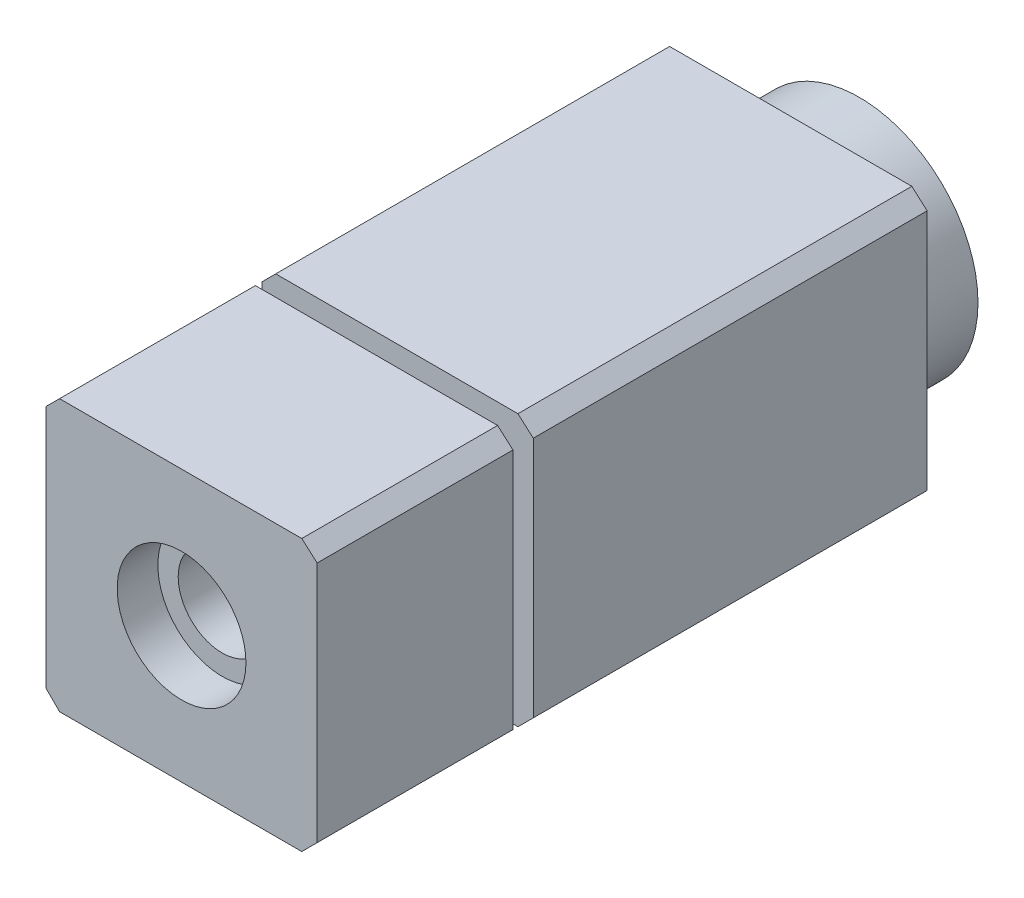
ISO-10303-21;
HEADER;
FILE_DESCRIPTION(('STEP AP214'),'2;1');
FILE_NAME('part.step','',(''),(''),'','','');
FILE_SCHEMA(('AUTOMOTIVE_DESIGN { 1 0 10303 214 1 1 1 1 }'));
ENDSEC;
DATA;
#1=APPLICATION_CONTEXT('core data for automotive mechanical design processes');
#2=APPLICATION_PROTOCOL_DEFINITION('international standard','automotive_design',2000,#1);
#3=PRODUCT_CONTEXT('',#1,'mechanical');
#4=PRODUCT('Part','Part','',(#3));
#5=PRODUCT_RELATED_PRODUCT_CATEGORY('part','',(#4));
#6=PRODUCT_DEFINITION_FORMATION('','',#4);
#7=PRODUCT_DEFINITION_CONTEXT('part definition',#1,'design');
#8=PRODUCT_DEFINITION('design','',#6,#7);
#9=PRODUCT_DEFINITION_SHAPE('','',#8);
#10=(LENGTH_UNIT() NAMED_UNIT(*) SI_UNIT(.MILLI.,.METRE.));
#11=(NAMED_UNIT(*) PLANE_ANGLE_UNIT() SI_UNIT($,.RADIAN.));
#12=(NAMED_UNIT(*) SI_UNIT($,.STERADIAN.) SOLID_ANGLE_UNIT());
#13=UNCERTAINTY_MEASURE_WITH_UNIT(LENGTH_MEASURE(1.E-05),#10,'distance_accuracy_value','');
#14=(GEOMETRIC_REPRESENTATION_CONTEXT(3) GLOBAL_UNCERTAINTY_ASSIGNED_CONTEXT((#13)) GLOBAL_UNIT_ASSIGNED_CONTEXT((#10,
#11,#12)) REPRESENTATION_CONTEXT('',''));
#15=CARTESIAN_POINT('',(0.,0.,0.));
#16=DIRECTION('',(0.,0.,1.));
#17=DIRECTION('',(1.,0.,0.));
#18=AXIS2_PLACEMENT_3D('',#15,#16,#17);
#19=CARTESIAN_POINT('',(-20.,18.,80.));
#20=DIRECTION('',(1.,0.,0.));
#21=DIRECTION('',(0.,0.,-1.));
#22=AXIS2_PLACEMENT_3D('',#19,#20,#21);
#23=PLANE('',#22);
#24=DIRECTION('',(0.,1.,0.));
#25=VECTOR('',#24,1.);
#26=CARTESIAN_POINT('',(-20.,-18.,61.11));
#27=LINE('',#26,#25);
#28=CARTESIAN_POINT('',(-20.,-18.,61.11));
#29=VERTEX_POINT('',#28);
#30=CARTESIAN_POINT('',(-20.,18.,61.11));
#31=VERTEX_POINT('',#30);
#32=EDGE_CURVE('E93',#29,#31,#27,.T.);
#33=ORIENTED_EDGE('',*,*,#32,.F.);
#34=DIRECTION('',(0.,0.,-1.));
#35=VECTOR('',#34,1.);
#36=CARTESIAN_POINT('',(-20.,-18.,80.));
#37=LINE('',#36,#35);
#38=CARTESIAN_POINT('',(-20.,-18.,90.));
#39=VERTEX_POINT('',#38);
#40=EDGE_CURVE('E77',#39,#29,#37,.T.);
#41=ORIENTED_EDGE('',*,*,#40,.F.);
#42=DIRECTION('',(0.,-1.,0.));
#43=VECTOR('',#42,1.);
#44=CARTESIAN_POINT('',(-20.,18.,90.));
#45=LINE('',#44,#43);
#46=CARTESIAN_POINT('',(-20.,18.,90.));
#47=VERTEX_POINT('',#46);
#48=EDGE_CURVE('E196',#47,#39,#45,.T.);
#49=ORIENTED_EDGE('',*,*,#48,.F.);
#50=DIRECTION('',(0.,0.,-1.));
#51=VECTOR('',#50,1.);
#52=CARTESIAN_POINT('',(-20.,18.,80.));
#53=LINE('',#52,#51);
#54=EDGE_CURVE('E183',#47,#31,#53,.T.);
#55=ORIENTED_EDGE('',*,*,#54,.T.);
#56=EDGE_LOOP('',(#33,#41,#49,#55));
#57=FACE_BOUND('',#56,.T.);
#58=ADVANCED_FACE('F67',(#57),#23,.F.);
#59=CARTESIAN_POINT('',(-18.,-20.,80.));
#60=DIRECTION('',(0.707106781186544,0.707106781186551,0.));
#61=DIRECTION('',(-0.707106781186551,0.707106781186544,0.));
#62=AXIS2_PLACEMENT_3D('',#59,#60,#61);
#63=PLANE('',#62);
#64=DIRECTION('',(-0.707106781186551,0.707106781186544,0.));
#65=VECTOR('',#64,1.);
#66=CARTESIAN_POINT('',(-18.,-20.,61.11));
#67=LINE('',#66,#65);
#68=CARTESIAN_POINT('',(-18.,-20.,61.11));
#69=VERTEX_POINT('',#68);
#70=EDGE_CURVE('E237',#69,#29,#67,.T.);
#71=ORIENTED_EDGE('',*,*,#70,.F.);
#72=DIRECTION('',(0.,0.,-1.));
#73=VECTOR('',#72,1.);
#74=CARTESIAN_POINT('',(-18.,-20.,80.));
#75=LINE('',#74,#73);
#76=CARTESIAN_POINT('',(-18.,-20.,90.));
#77=VERTEX_POINT('',#76);
#78=EDGE_CURVE('E371',#77,#69,#75,.T.);
#79=ORIENTED_EDGE('',*,*,#78,.F.);
#80=DIRECTION('',(0.707106781186551,-0.707106781186544,0.));
#81=VECTOR('',#80,1.);
#82=CARTESIAN_POINT('',(-20.,-18.,90.));
#83=LINE('',#82,#81);
#84=EDGE_CURVE('E202',#39,#77,#83,.T.);
#85=ORIENTED_EDGE('',*,*,#84,.F.);
#86=ORIENTED_EDGE('',*,*,#40,.T.);
#87=EDGE_LOOP('',(#71,#79,#85,#86));
#88=FACE_BOUND('',#87,.T.);
#89=ADVANCED_FACE('F507',(#88),#63,.F.);
#90=CARTESIAN_POINT('',(-18.,-20.,80.));
#91=DIRECTION('',(0.,1.,0.));
#92=DIRECTION('',(0.,0.,1.));
#93=AXIS2_PLACEMENT_3D('',#90,#91,#92);
#94=PLANE('',#93);
#95=DIRECTION('',(-1.,0.,0.));
#96=VECTOR('',#95,1.);
#97=CARTESIAN_POINT('',(17.7358097334592,-20.,61.11));
#98=LINE('',#97,#96);
#99=CARTESIAN_POINT('',(17.7358097334592,-20.,61.11));
#100=VERTEX_POINT('',#99);
#101=EDGE_CURVE('E246',#100,#69,#98,.T.);
#102=ORIENTED_EDGE('',*,*,#101,.F.);
#103=DIRECTION('',(0.,0.,-1.));
#104=VECTOR('',#103,1.);
#105=CARTESIAN_POINT('',(17.7358097334592,-20.,80.));
#106=LINE('',#105,#104);
#107=CARTESIAN_POINT('',(17.7358097334592,-20.,90.));
#108=VERTEX_POINT('',#107);
#109=EDGE_CURVE('E366',#108,#100,#106,.T.);
#110=ORIENTED_EDGE('',*,*,#109,.F.);
#111=DIRECTION('',(1.,0.,0.));
#112=VECTOR('',#111,1.);
#113=CARTESIAN_POINT('',(-18.,-20.,90.));
#114=LINE('',#113,#112);
#115=EDGE_CURVE('E215',#77,#108,#114,.T.);
#116=ORIENTED_EDGE('',*,*,#115,.F.);
#117=ORIENTED_EDGE('',*,*,#78,.T.);
#118=EDGE_LOOP('',(#102,#110,#116,#117));
#119=FACE_BOUND('',#118,.T.);
#120=ADVANCED_FACE('F511',(#119),#94,.F.);
#121=CARTESIAN_POINT('',(17.7358097334592,-20.,80.));
#122=DIRECTION('',(-0.707106781186549,0.707106781186546,0.));
#123=DIRECTION('',(-0.707106781186546,-0.707106781186549,0.));
#124=AXIS2_PLACEMENT_3D('',#121,#122,#123);
#125=PLANE('',#124);
#126=DIRECTION('',(-0.707106781186546,-0.707106781186548,0.));
#127=VECTOR('',#126,1.);
#128=CARTESIAN_POINT('',(20.,-17.7358097334592,61.11));
#129=LINE('',#128,#127);
#130=CARTESIAN_POINT('',(20.,-17.7358097334592,61.11));
#131=VERTEX_POINT('',#130);
#132=EDGE_CURVE('E286',#131,#100,#129,.T.);
#133=ORIENTED_EDGE('',*,*,#132,.F.);
#134=DIRECTION('',(0.,0.,-1.));
#135=VECTOR('',#134,1.);
#136=CARTESIAN_POINT('',(20.,-17.7358097334592,80.));
#137=LINE('',#136,#135);
#138=CARTESIAN_POINT('',(20.,-17.7358097334592,90.));
#139=VERTEX_POINT('',#138);
#140=EDGE_CURVE('E361',#139,#131,#137,.T.);
#141=ORIENTED_EDGE('',*,*,#140,.F.);
#142=DIRECTION('',(0.707106781186546,0.707106781186548,0.));
#143=VECTOR('',#142,1.);
#144=CARTESIAN_POINT('',(17.7358097334592,-20.,90.));
#145=LINE('',#144,#143);
#146=EDGE_CURVE('E219',#108,#139,#145,.T.);
#147=ORIENTED_EDGE('',*,*,#146,.F.);
#148=ORIENTED_EDGE('',*,*,#109,.T.);
#149=EDGE_LOOP('',(#133,#141,#147,#148));
#150=FACE_BOUND('',#149,.T.);
#151=ADVANCED_FACE('F539',(#150),#125,.F.);
#152=CARTESIAN_POINT('',(20.,18.,80.));
#153=DIRECTION('',(-1.,0.,0.));
#154=DIRECTION('',(0.,0.,1.));
#155=AXIS2_PLACEMENT_3D('',#152,#153,#154);
#156=PLANE('',#155);
#157=DIRECTION('',(0.,-1.,0.));
#158=VECTOR('',#157,1.);
#159=CARTESIAN_POINT('',(20.,18.,61.11));
#160=LINE('',#159,#158);
#161=CARTESIAN_POINT('',(20.,18.,61.11));
#162=VERTEX_POINT('',#161);
#163=EDGE_CURVE('E283',#162,#131,#160,.T.);
#164=ORIENTED_EDGE('',*,*,#163,.F.);
#165=DIRECTION('',(0.,0.,-1.));
#166=VECTOR('',#165,1.);
#167=CARTESIAN_POINT('',(20.,18.,80.));
#168=LINE('',#167,#166);
#169=CARTESIAN_POINT('',(20.,18.,90.));
#170=VERTEX_POINT('',#169);
#171=EDGE_CURVE('E356',#170,#162,#168,.T.);
#172=ORIENTED_EDGE('',*,*,#171,.F.);
#173=DIRECTION('',(0.,1.,0.));
#174=VECTOR('',#173,1.);
#175=CARTESIAN_POINT('',(20.,-17.7358097334592,90.));
#176=LINE('',#175,#174);
#177=EDGE_CURVE('E223',#139,#170,#176,.T.);
#178=ORIENTED_EDGE('',*,*,#177,.F.);
#179=ORIENTED_EDGE('',*,*,#140,.T.);
#180=EDGE_LOOP('',(#164,#172,#178,#179));
#181=FACE_BOUND('',#180,.T.);
#182=ADVANCED_FACE('F536',(#181),#156,.F.);
#183=CARTESIAN_POINT('',(17.7358097334592,20.,80.));
#184=DIRECTION('',(-0.662028211883854,-0.749478916761417,0.));
#185=DIRECTION('',(0.749478916761417,-0.662028211883854,0.));
#186=AXIS2_PLACEMENT_3D('',#183,#184,#185);
#187=PLANE('',#186);
#188=DIRECTION('',(0.749478916761417,-0.662028211883854,0.));
#189=VECTOR('',#188,1.);
#190=CARTESIAN_POINT('',(17.7358097334592,20.,61.11));
#191=LINE('',#190,#189);
#192=CARTESIAN_POINT('',(17.7358097334592,20.,61.11));
#193=VERTEX_POINT('',#192);
#194=EDGE_CURVE('E280',#193,#162,#191,.T.);
#195=ORIENTED_EDGE('',*,*,#194,.F.);
#196=DIRECTION('',(0.,0.,-1.));
#197=VECTOR('',#196,1.);
#198=CARTESIAN_POINT('',(17.7358097334592,20.,80.));
#199=LINE('',#198,#197);
#200=CARTESIAN_POINT('',(17.7358097334592,20.,90.));
#201=VERTEX_POINT('',#200);
#202=EDGE_CURVE('E351',#201,#193,#199,.T.);
#203=ORIENTED_EDGE('',*,*,#202,.F.);
#204=DIRECTION('',(-0.749478916761417,0.662028211883854,0.));
#205=VECTOR('',#204,1.);
#206=CARTESIAN_POINT('',(20.,18.,90.));
#207=LINE('',#206,#205);
#208=EDGE_CURVE('E227',#170,#201,#207,.T.);
#209=ORIENTED_EDGE('',*,*,#208,.F.);
#210=ORIENTED_EDGE('',*,*,#171,.T.);
#211=EDGE_LOOP('',(#195,#203,#209,#210));
#212=FACE_BOUND('',#211,.T.);
#213=ADVANCED_FACE('F522',(#212),#187,.F.);
#214=CARTESIAN_POINT('',(-18.,20.,80.));
#215=DIRECTION('',(0.,-1.,0.));
#216=DIRECTION('',(0.,0.,-1.));
#217=AXIS2_PLACEMENT_3D('',#214,#215,#216);
#218=PLANE('',#217);
#219=DIRECTION('',(1.,0.,0.));
#220=VECTOR('',#219,1.);
#221=CARTESIAN_POINT('',(-18.,20.,61.11));
#222=LINE('',#221,#220);
#223=CARTESIAN_POINT('',(-18.,20.,61.11));
#224=VERTEX_POINT('',#223);
#225=EDGE_CURVE('E277',#224,#193,#222,.T.);
#226=ORIENTED_EDGE('',*,*,#225,.F.);
#227=DIRECTION('',(0.,0.,-1.));
#228=VECTOR('',#227,1.);
#229=CARTESIAN_POINT('',(-18.,20.,80.));
#230=LINE('',#229,#228);
#231=CARTESIAN_POINT('',(-18.,20.,90.));
#232=VERTEX_POINT('',#231);
#233=EDGE_CURVE('E347',#232,#224,#230,.T.);
#234=ORIENTED_EDGE('',*,*,#233,.F.);
#235=DIRECTION('',(-1.,0.,0.));
#236=VECTOR('',#235,1.);
#237=CARTESIAN_POINT('',(17.7358097334592,20.,90.));
#238=LINE('',#237,#236);
#239=EDGE_CURVE('E208',#201,#232,#238,.T.);
#240=ORIENTED_EDGE('',*,*,#239,.F.);
#241=ORIENTED_EDGE('',*,*,#202,.T.);
#242=EDGE_LOOP('',(#226,#234,#240,#241));
#243=FACE_BOUND('',#242,.T.);
#244=ADVANCED_FACE('F517',(#243),#218,.F.);
#245=CARTESIAN_POINT('',(-20.,18.,80.));
#246=DIRECTION('',(0.707106781186548,-0.707106781186548,0.));
#247=DIRECTION('',(0.707106781186548,0.707106781186548,0.));
#248=AXIS2_PLACEMENT_3D('',#245,#246,#247);
#249=PLANE('',#248);
#250=DIRECTION('',(0.707106781186548,0.707106781186548,0.));
#251=VECTOR('',#250,1.);
#252=CARTESIAN_POINT('',(-20.,18.,61.11));
#253=LINE('',#252,#251);
#254=EDGE_CURVE('E189',#31,#224,#253,.T.);
#255=ORIENTED_EDGE('',*,*,#254,.F.);
#256=ORIENTED_EDGE('',*,*,#54,.F.);
#257=DIRECTION('',(-0.707106781186548,-0.707106781186548,0.));
#258=VECTOR('',#257,1.);
#259=CARTESIAN_POINT('',(-18.,20.,90.));
#260=LINE('',#259,#258);
#261=EDGE_CURVE('E188',#232,#47,#260,.T.);
#262=ORIENTED_EDGE('',*,*,#261,.F.);
#263=ORIENTED_EDGE('',*,*,#233,.T.);
#264=EDGE_LOOP('',(#255,#256,#262,#263));
#265=FACE_BOUND('',#264,.T.);
#266=ADVANCED_FACE('F185',(#265),#249,.F.);
#267=CARTESIAN_POINT('',(-20.,-18.,58.11));
#268=VERTEX_POINT('',#267);
#269=CARTESIAN_POINT('',(-20.,-18.,0.));
#270=VERTEX_POINT('',#269);
#271=EDGE_CURVE('E374',#268,#270,#37,.T.);
#272=ORIENTED_EDGE('',*,*,#271,.F.);
#273=DIRECTION('',(0.,1.,0.));
#274=VECTOR('',#273,1.);
#275=CARTESIAN_POINT('',(-20.,-18.,58.11));
#276=LINE('',#275,#274);
#277=CARTESIAN_POINT('',(-20.,18.,58.11));
#278=VERTEX_POINT('',#277);
#279=EDGE_CURVE('E245',#268,#278,#276,.T.);
#280=ORIENTED_EDGE('',*,*,#279,.T.);
#281=CARTESIAN_POINT('',(-20.,18.,0.));
#282=VERTEX_POINT('',#281);
#283=EDGE_CURVE('E193',#278,#282,#53,.T.);
#284=ORIENTED_EDGE('',*,*,#283,.T.);
#285=DIRECTION('',(0.,-1.,0.));
#286=VECTOR('',#285,1.);
#287=CARTESIAN_POINT('',(-20.,18.,0.));
#288=LINE('',#287,#286);
#289=EDGE_CURVE('E314',#282,#270,#288,.T.);
#290=ORIENTED_EDGE('',*,*,#289,.T.);
#291=EDGE_LOOP('',(#272,#280,#284,#290));
#292=FACE_BOUND('',#291,.T.);
#293=ADVANCED_FACE('F69',(#292),#23,.F.);
#294=CARTESIAN_POINT('',(-18.,-20.,58.11));
#295=VERTEX_POINT('',#294);
#296=CARTESIAN_POINT('',(-18.,-20.,0.));
#297=VERTEX_POINT('',#296);
#298=EDGE_CURVE('E370',#295,#297,#75,.T.);
#299=ORIENTED_EDGE('',*,*,#298,.F.);
#300=DIRECTION('',(-0.707106781186551,0.707106781186544,0.));
#301=VECTOR('',#300,1.);
#302=CARTESIAN_POINT('',(-18.,-20.,58.11));
#303=LINE('',#302,#301);
#304=EDGE_CURVE('E241',#295,#268,#303,.T.);
#305=ORIENTED_EDGE('',*,*,#304,.T.);
#306=ORIENTED_EDGE('',*,*,#271,.T.);
#307=DIRECTION('',(0.707106781186551,-0.707106781186544,0.));
#308=VECTOR('',#307,1.);
#309=CARTESIAN_POINT('',(-18.,-20.,0.));
#310=LINE('',#309,#308);
#311=EDGE_CURVE('E319',#270,#297,#310,.T.);
#312=ORIENTED_EDGE('',*,*,#311,.T.);
#313=EDGE_LOOP('',(#299,#305,#306,#312));
#314=FACE_BOUND('',#313,.T.);
#315=ADVANCED_FACE('F385',(#314),#63,.F.);
#316=CARTESIAN_POINT('',(17.7358097334592,-20.,58.11));
#317=VERTEX_POINT('',#316);
#318=CARTESIAN_POINT('',(17.7358097334592,-20.,0.));
#319=VERTEX_POINT('',#318);
#320=EDGE_CURVE('E365',#317,#319,#106,.T.);
#321=ORIENTED_EDGE('',*,*,#320,.F.);
#322=DIRECTION('',(-1.,0.,0.));
#323=VECTOR('',#322,1.);
#324=CARTESIAN_POINT('',(17.7358097334592,-20.,58.11));
#325=LINE('',#324,#323);
#326=EDGE_CURVE('E267',#317,#295,#325,.T.);
#327=ORIENTED_EDGE('',*,*,#326,.T.);
#328=ORIENTED_EDGE('',*,*,#298,.T.);
#329=DIRECTION('',(1.,0.,0.));
#330=VECTOR('',#329,1.);
#331=CARTESIAN_POINT('',(-18.,-20.,0.));
#332=LINE('',#331,#330);
#333=EDGE_CURVE('E323',#297,#319,#332,.T.);
#334=ORIENTED_EDGE('',*,*,#333,.T.);
#335=EDGE_LOOP('',(#321,#327,#328,#334));
#336=FACE_BOUND('',#335,.T.);
#337=ADVANCED_FACE('F417',(#336),#94,.F.);
#338=CARTESIAN_POINT('',(20.,-17.7358097334592,58.11));
#339=VERTEX_POINT('',#338);
#340=CARTESIAN_POINT('',(20.,-17.7358097334592,0.));
#341=VERTEX_POINT('',#340);
#342=EDGE_CURVE('E360',#339,#341,#137,.T.);
#343=ORIENTED_EDGE('',*,*,#342,.F.);
#344=DIRECTION('',(-0.707106781186546,-0.707106781186548,0.));
#345=VECTOR('',#344,1.);
#346=CARTESIAN_POINT('',(20.,-17.7358097334592,58.11));
#347=LINE('',#346,#345);
#348=EDGE_CURVE('E263',#339,#317,#347,.T.);
#349=ORIENTED_EDGE('',*,*,#348,.T.);
#350=ORIENTED_EDGE('',*,*,#320,.T.);
#351=DIRECTION('',(0.707106781186546,0.707106781186548,0.));
#352=VECTOR('',#351,1.);
#353=CARTESIAN_POINT('',(17.7358097334592,-20.,0.));
#354=LINE('',#353,#352);
#355=EDGE_CURVE('E327',#319,#341,#354,.T.);
#356=ORIENTED_EDGE('',*,*,#355,.T.);
#357=EDGE_LOOP('',(#343,#349,#350,#356));
#358=FACE_BOUND('',#357,.T.);
#359=ADVANCED_FACE('F413',(#358),#125,.F.);
#360=CARTESIAN_POINT('',(20.,18.,58.11));
#361=VERTEX_POINT('',#360);
#362=CARTESIAN_POINT('',(20.,18.,0.));
#363=VERTEX_POINT('',#362);
#364=EDGE_CURVE('E355',#361,#363,#168,.T.);
#365=ORIENTED_EDGE('',*,*,#364,.F.);
#366=DIRECTION('',(0.,-1.,0.));
#367=VECTOR('',#366,1.);
#368=CARTESIAN_POINT('',(20.,18.,58.11));
#369=LINE('',#368,#367);
#370=EDGE_CURVE('E259',#361,#339,#369,.T.);
#371=ORIENTED_EDGE('',*,*,#370,.T.);
#372=ORIENTED_EDGE('',*,*,#342,.T.);
#373=DIRECTION('',(0.,1.,0.));
#374=VECTOR('',#373,1.);
#375=CARTESIAN_POINT('',(20.,18.,0.));
#376=LINE('',#375,#374);
#377=EDGE_CURVE('E331',#341,#363,#376,.T.);
#378=ORIENTED_EDGE('',*,*,#377,.T.);
#379=EDGE_LOOP('',(#365,#371,#372,#378));
#380=FACE_BOUND('',#379,.T.);
#381=ADVANCED_FACE('F410',(#380),#156,.F.);
#382=CARTESIAN_POINT('',(17.7358097334592,20.,58.11));
#383=VERTEX_POINT('',#382);
#384=CARTESIAN_POINT('',(17.7358097334592,20.,0.));
#385=VERTEX_POINT('',#384);
#386=EDGE_CURVE('E350',#383,#385,#199,.T.);
#387=ORIENTED_EDGE('',*,*,#386,.F.);
#388=DIRECTION('',(0.749478916761417,-0.662028211883854,0.));
#389=VECTOR('',#388,1.);
#390=CARTESIAN_POINT('',(17.7358097334592,20.,58.11));
#391=LINE('',#390,#389);
#392=EDGE_CURVE('E255',#383,#361,#391,.T.);
#393=ORIENTED_EDGE('',*,*,#392,.T.);
#394=ORIENTED_EDGE('',*,*,#364,.T.);
#395=DIRECTION('',(-0.749478916761417,0.662028211883854,0.));
#396=VECTOR('',#395,1.);
#397=CARTESIAN_POINT('',(17.7358097334592,20.,0.));
#398=LINE('',#397,#396);
#399=EDGE_CURVE('E335',#363,#385,#398,.T.);
#400=ORIENTED_EDGE('',*,*,#399,.T.);
#401=EDGE_LOOP('',(#387,#393,#394,#400));
#402=FACE_BOUND('',#401,.T.);
#403=ADVANCED_FACE('F406',(#402),#187,.F.);
#404=CARTESIAN_POINT('',(-18.,20.,58.11));
#405=VERTEX_POINT('',#404);
#406=CARTESIAN_POINT('',(-18.,20.,0.));
#407=VERTEX_POINT('',#406);
#408=EDGE_CURVE('E192',#405,#407,#230,.T.);
#409=ORIENTED_EDGE('',*,*,#408,.F.);
#410=DIRECTION('',(1.,0.,0.));
#411=VECTOR('',#410,1.);
#412=CARTESIAN_POINT('',(-18.,20.,58.11));
#413=LINE('',#412,#411);
#414=EDGE_CURVE('E85',#405,#383,#413,.T.);
#415=ORIENTED_EDGE('',*,*,#414,.T.);
#416=ORIENTED_EDGE('',*,*,#386,.T.);
#417=DIRECTION('',(-1.,0.,0.));
#418=VECTOR('',#417,1.);
#419=CARTESIAN_POINT('',(-18.,20.,0.));
#420=LINE('',#419,#418);
#421=EDGE_CURVE('E339',#385,#407,#420,.T.);
#422=ORIENTED_EDGE('',*,*,#421,.T.);
#423=EDGE_LOOP('',(#409,#415,#416,#422));
#424=FACE_BOUND('',#423,.T.);
#425=ADVANCED_FACE('F402',(#424),#218,.F.);
#426=ORIENTED_EDGE('',*,*,#283,.F.);
#427=DIRECTION('',(0.707106781186548,0.707106781186548,0.));
#428=VECTOR('',#427,1.);
#429=CARTESIAN_POINT('',(-20.,18.,58.11));
#430=LINE('',#429,#428);
#431=EDGE_CURVE('E250',#278,#405,#430,.T.);
#432=ORIENTED_EDGE('',*,*,#431,.T.);
#433=ORIENTED_EDGE('',*,*,#408,.T.);
#434=DIRECTION('',(-0.707106781186548,-0.707106781186548,0.));
#435=VECTOR('',#434,1.);
#436=CARTESIAN_POINT('',(-20.,18.,0.));
#437=LINE('',#436,#435);
#438=EDGE_CURVE('E343',#407,#282,#437,.T.);
#439=ORIENTED_EDGE('',*,*,#438,.T.);
#440=EDGE_LOOP('',(#426,#432,#433,#439));
#441=FACE_BOUND('',#440,.T.);
#442=ADVANCED_FACE('F396',(#441),#249,.F.);
#443=CARTESIAN_POINT('',(0.,0.,0.));
#444=DIRECTION('',(0.,0.,1.));
#445=DIRECTION('',(1.,0.,0.));
#446=AXIS2_PLACEMENT_3D('',#443,#444,#445);
#447=PLANE('',#446);
#448=CARTESIAN_POINT('',(0.,0.,0.));
#449=DIRECTION('',(0.,0.,-1.));
#450=DIRECTION('',(-1.,0.,0.));
#451=AXIS2_PLACEMENT_3D('',#448,#449,#450);
#452=CIRCLE('',#451,17.5);
#453=CARTESIAN_POINT('',(-17.5,0.,0.));
#454=VERTEX_POINT('',#453);
#455=EDGE_CURVE('E12',#454,#454,#452,.T.);
#456=ORIENTED_EDGE('',*,*,#455,.F.);
#457=EDGE_LOOP('',(#456));
#458=FACE_BOUND('',#457,.T.);
#459=ORIENTED_EDGE('',*,*,#289,.F.);
#460=ORIENTED_EDGE('',*,*,#438,.F.);
#461=ORIENTED_EDGE('',*,*,#421,.F.);
#462=ORIENTED_EDGE('',*,*,#399,.F.);
#463=ORIENTED_EDGE('',*,*,#377,.F.);
#464=ORIENTED_EDGE('',*,*,#355,.F.);
#465=ORIENTED_EDGE('',*,*,#333,.F.);
#466=ORIENTED_EDGE('',*,*,#311,.F.);
#467=EDGE_LOOP('',(#459,#460,#461,#462,#463,#464,#465,#466));
#468=FACE_BOUND('',#467,.T.);
#469=ADVANCED_FACE('F390',(#458,#468),#447,.F.);
#470=CARTESIAN_POINT('',(0.,0.,90.));
#471=DIRECTION('',(0.,0.,1.));
#472=DIRECTION('',(1.,0.,0.));
#473=AXIS2_PLACEMENT_3D('',#470,#471,#472);
#474=PLANE('',#473);
#475=CARTESIAN_POINT('',(0.,0.,90.));
#476=DIRECTION('',(0.,0.,1.));
#477=DIRECTION('',(1.,0.,0.));
#478=AXIS2_PLACEMENT_3D('',#475,#476,#477);
#479=CIRCLE('',#478,9.5);
#480=CARTESIAN_POINT('',(9.5,0.,90.));
#481=VERTEX_POINT('',#480);
#482=EDGE_CURVE('E295',#481,#481,#479,.T.);
#483=ORIENTED_EDGE('',*,*,#482,.F.);
#484=EDGE_LOOP('',(#483));
#485=FACE_BOUND('',#484,.T.);
#486=ORIENTED_EDGE('',*,*,#261,.T.);
#487=ORIENTED_EDGE('',*,*,#48,.T.);
#488=ORIENTED_EDGE('',*,*,#84,.T.);
#489=ORIENTED_EDGE('',*,*,#115,.T.);
#490=ORIENTED_EDGE('',*,*,#146,.T.);
#491=ORIENTED_EDGE('',*,*,#177,.T.);
#492=ORIENTED_EDGE('',*,*,#208,.T.);
#493=ORIENTED_EDGE('',*,*,#239,.T.);
#494=EDGE_LOOP('',(#486,#487,#488,#489,#490,#491,#492,#493));
#495=FACE_BOUND('',#494,.T.);
#496=ADVANCED_FACE('F205',(#485,#495),#474,.T.);
#497=CARTESIAN_POINT('',(0.,0.,-10.));
#498=DIRECTION('',(0.,0.,1.));
#499=DIRECTION('',(1.,0.,0.));
#500=AXIS2_PLACEMENT_3D('',#497,#498,#499);
#501=CYLINDRICAL_SURFACE('',#500,17.5);
#502=CARTESIAN_POINT('',(0.,0.,-10.));
#503=DIRECTION('',(0.,0.,-1.));
#504=DIRECTION('',(-1.,0.,0.));
#505=AXIS2_PLACEMENT_3D('',#502,#503,#504);
#506=CIRCLE('',#505,17.5);
#507=CARTESIAN_POINT('',(-17.5,0.,-10.));
#508=VERTEX_POINT('',#507);
#509=EDGE_CURVE('E308',#508,#508,#506,.T.);
#510=ORIENTED_EDGE('',*,*,#509,.F.);
#511=EDGE_LOOP('',(#510));
#512=FACE_BOUND('',#511,.T.);
#513=ORIENTED_EDGE('',*,*,#455,.T.);
#514=EDGE_LOOP('',(#513));
#515=FACE_BOUND('',#514,.T.);
#516=ADVANCED_FACE('F495',(#512,#515),#501,.T.);
#517=CARTESIAN_POINT('',(0.,0.,-10.));
#518=DIRECTION('',(0.,0.,-1.));
#519=DIRECTION('',(-1.,0.,0.));
#520=AXIS2_PLACEMENT_3D('',#517,#518,#519);
#521=PLANE('',#520);
#522=CARTESIAN_POINT('',(0.,0.,-10.));
#523=DIRECTION('',(0.,0.,-1.));
#524=DIRECTION('',(-1.,0.,0.));
#525=AXIS2_PLACEMENT_3D('',#522,#523,#524);
#526=CIRCLE('',#525,9.5);
#527=CARTESIAN_POINT('',(-9.5,0.,-10.));
#528=VERTEX_POINT('',#527);
#529=EDGE_CURVE('E300',#528,#528,#526,.T.);
#530=ORIENTED_EDGE('',*,*,#529,.F.);
#531=EDGE_LOOP('',(#530));
#532=FACE_BOUND('',#531,.T.);
#533=ORIENTED_EDGE('',*,*,#509,.T.);
#534=EDGE_LOOP('',(#533));
#535=FACE_BOUND('',#534,.T.);
#536=ADVANCED_FACE('F501',(#532,#535),#521,.T.);
#537=CARTESIAN_POINT('',(0.,0.,-4.));
#538=DIRECTION('',(0.,0.,-1.));
#539=DIRECTION('',(-1.,0.,0.));
#540=AXIS2_PLACEMENT_3D('',#537,#538,#539);
#541=CYLINDRICAL_SURFACE('',#540,9.5);
#542=CARTESIAN_POINT('',(0.,0.,-4.));
#543=DIRECTION('',(0.,0.,-1.));
#544=DIRECTION('',(-1.,0.,0.));
#545=AXIS2_PLACEMENT_3D('',#542,#543,#544);
#546=CIRCLE('',#545,9.5);
#547=CARTESIAN_POINT('',(-9.5,0.,-4.));
#548=VERTEX_POINT('',#547);
#549=EDGE_CURVE('E304',#548,#548,#546,.T.);
#550=ORIENTED_EDGE('',*,*,#549,.F.);
#551=EDGE_LOOP('',(#550));
#552=FACE_BOUND('',#551,.T.);
#553=ORIENTED_EDGE('',*,*,#529,.T.);
#554=EDGE_LOOP('',(#553));
#555=FACE_BOUND('',#554,.T.);
#556=ADVANCED_FACE('F580',(#552,#555),#541,.F.);
#557=CARTESIAN_POINT('',(0.,0.,-4.));
#558=DIRECTION('',(0.,0.,-1.));
#559=DIRECTION('',(-1.,0.,0.));
#560=AXIS2_PLACEMENT_3D('',#557,#558,#559);
#561=PLANE('',#560);
#562=CARTESIAN_POINT('',(0.,0.,-4.));
#563=DIRECTION('',(0.,0.,-1.));
#564=DIRECTION('',(-1.,0.,0.));
#565=AXIS2_PLACEMENT_3D('',#562,#563,#564);
#566=CIRCLE('',#565,6.5);
#567=CARTESIAN_POINT('',(-6.5,0.,-4.));
#568=VERTEX_POINT('',#567);
#569=EDGE_CURVE('E291',#568,#568,#566,.T.);
#570=ORIENTED_EDGE('',*,*,#569,.F.);
#571=EDGE_LOOP('',(#570));
#572=FACE_BOUND('',#571,.T.);
#573=ORIENTED_EDGE('',*,*,#549,.T.);
#574=EDGE_LOOP('',(#573));
#575=FACE_BOUND('',#574,.T.);
#576=ADVANCED_FACE('F490',(#572,#575),#561,.T.);
#577=CARTESIAN_POINT('',(0.,0.,84.));
#578=DIRECTION('',(0.,0.,1.));
#579=DIRECTION('',(1.,0.,0.));
#580=AXIS2_PLACEMENT_3D('',#577,#578,#579);
#581=CYLINDRICAL_SURFACE('',#580,9.5);
#582=CARTESIAN_POINT('',(0.,0.,84.));
#583=DIRECTION('',(0.,0.,1.));
#584=DIRECTION('',(1.,0.,0.));
#585=AXIS2_PLACEMENT_3D('',#582,#583,#584);
#586=CIRCLE('',#585,9.5);
#587=CARTESIAN_POINT('',(9.5,0.,84.));
#588=VERTEX_POINT('',#587);
#589=EDGE_CURVE('E296',#588,#588,#586,.T.);
#590=ORIENTED_EDGE('',*,*,#589,.F.);
#591=EDGE_LOOP('',(#590));
#592=FACE_BOUND('',#591,.T.);
#593=ORIENTED_EDGE('',*,*,#482,.T.);
#594=EDGE_LOOP('',(#593));
#595=FACE_BOUND('',#594,.T.);
#596=ADVANCED_FACE('F484',(#592,#595),#581,.F.);
#597=CARTESIAN_POINT('',(0.,0.,84.));
#598=DIRECTION('',(0.,0.,1.));
#599=DIRECTION('',(1.,0.,0.));
#600=AXIS2_PLACEMENT_3D('',#597,#598,#599);
#601=PLANE('',#600);
#602=CARTESIAN_POINT('',(0.,0.,84.));
#603=DIRECTION('',(0.,0.,1.));
#604=DIRECTION('',(1.,0.,0.));
#605=AXIS2_PLACEMENT_3D('',#602,#603,#604);
#606=CIRCLE('',#605,6.5);
#607=CARTESIAN_POINT('',(6.5,0.,84.));
#608=VERTEX_POINT('',#607);
#609=EDGE_CURVE('E71',#608,#608,#606,.T.);
#610=ORIENTED_EDGE('',*,*,#609,.F.);
#611=EDGE_LOOP('',(#610));
#612=FACE_BOUND('',#611,.T.);
#613=ORIENTED_EDGE('',*,*,#589,.T.);
#614=EDGE_LOOP('',(#613));
#615=FACE_BOUND('',#614,.T.);
#616=ADVANCED_FACE('F481',(#612,#615),#601,.T.);
#617=CARTESIAN_POINT('',(0.,0.,90.));
#618=DIRECTION('',(0.,0.,-1.));
#619=DIRECTION('',(-1.,0.,0.));
#620=AXIS2_PLACEMENT_3D('',#617,#618,#619);
#621=CYLINDRICAL_SURFACE('',#620,6.5);
#622=ORIENTED_EDGE('',*,*,#569,.T.);
#623=EDGE_LOOP('',(#622));
#624=FACE_BOUND('',#623,.T.);
#625=ORIENTED_EDGE('',*,*,#609,.T.);
#626=EDGE_LOOP('',(#625));
#627=FACE_BOUND('',#626,.T.);
#628=ADVANCED_FACE('F479',(#624,#627),#621,.F.);
#629=CARTESIAN_POINT('',(0.,0.,58.11));
#630=DIRECTION('',(0.,0.,-1.));
#631=DIRECTION('',(-1.,0.,0.));
#632=AXIS2_PLACEMENT_3D('',#629,#630,#631);
#633=PLANE('',#632);
#634=CARTESIAN_POINT('',(0.,0.,58.11));
#635=DIRECTION('',(0.,0.,1.));
#636=DIRECTION('',(1.,0.,0.));
#637=AXIS2_PLACEMENT_3D('',#634,#635,#636);
#638=CIRCLE('',#637,14.5);
#639=CARTESIAN_POINT('',(14.5,0.,58.11));
#640=VERTEX_POINT('',#639);
#641=EDGE_CURVE('E233',#640,#640,#638,.T.);
#642=ORIENTED_EDGE('',*,*,#641,.F.);
#643=EDGE_LOOP('',(#642));
#644=FACE_BOUND('',#643,.T.);
#645=ORIENTED_EDGE('',*,*,#304,.F.);
#646=ORIENTED_EDGE('',*,*,#326,.F.);
#647=ORIENTED_EDGE('',*,*,#348,.F.);
#648=ORIENTED_EDGE('',*,*,#370,.F.);
#649=ORIENTED_EDGE('',*,*,#392,.F.);
#650=ORIENTED_EDGE('',*,*,#414,.F.);
#651=ORIENTED_EDGE('',*,*,#431,.F.);
#652=ORIENTED_EDGE('',*,*,#279,.F.);
#653=EDGE_LOOP('',(#645,#646,#647,#648,#649,#650,#651,#652));
#654=FACE_BOUND('',#653,.T.);
#655=ADVANCED_FACE('F563',(#644,#654),#633,.F.);
#656=CARTESIAN_POINT('',(0.,0.,61.11));
#657=DIRECTION('',(0.,0.,-1.));
#658=DIRECTION('',(-1.,0.,0.));
#659=AXIS2_PLACEMENT_3D('',#656,#657,#658);
#660=PLANE('',#659);
#661=CARTESIAN_POINT('',(0.,0.,61.11));
#662=DIRECTION('',(0.,0.,1.));
#663=DIRECTION('',(1.,0.,0.));
#664=AXIS2_PLACEMENT_3D('',#661,#662,#663);
#665=CIRCLE('',#664,14.5);
#666=CARTESIAN_POINT('',(14.5,0.,61.11));
#667=VERTEX_POINT('',#666);
#668=EDGE_CURVE('E232',#667,#667,#665,.T.);
#669=ORIENTED_EDGE('',*,*,#668,.T.);
#670=EDGE_LOOP('',(#669));
#671=FACE_BOUND('',#670,.T.);
#672=ORIENTED_EDGE('',*,*,#70,.T.);
#673=ORIENTED_EDGE('',*,*,#32,.T.);
#674=ORIENTED_EDGE('',*,*,#254,.T.);
#675=ORIENTED_EDGE('',*,*,#225,.T.);
#676=ORIENTED_EDGE('',*,*,#194,.T.);
#677=ORIENTED_EDGE('',*,*,#163,.T.);
#678=ORIENTED_EDGE('',*,*,#132,.T.);
#679=ORIENTED_EDGE('',*,*,#101,.T.);
#680=EDGE_LOOP('',(#672,#673,#674,#675,#676,#677,#678,#679));
#681=FACE_BOUND('',#680,.T.);
#682=ADVANCED_FACE('F560',(#671,#681),#660,.T.);
#683=CARTESIAN_POINT('',(0.,0.,58.11));
#684=DIRECTION('',(0.,0.,1.));
#685=DIRECTION('',(1.,0.,0.));
#686=AXIS2_PLACEMENT_3D('',#683,#684,#685);
#687=CYLINDRICAL_SURFACE('',#686,14.5);
#688=ORIENTED_EDGE('',*,*,#641,.T.);
#689=EDGE_LOOP('',(#688));
#690=FACE_BOUND('',#689,.T.);
#691=ORIENTED_EDGE('',*,*,#668,.F.);
#692=EDGE_LOOP('',(#691));
#693=FACE_BOUND('',#692,.T.);
#694=ADVANCED_FACE('F562',(#690,#693),#687,.T.);
#695=CLOSED_SHELL('',(#58,#89,#120,#151,#182,#213,#244,#266,#293,#315,#337,#359,#381,#403,#425,
#442,#469,#496,#516,#536,#556,#576,#596,#616,#628,#655,#682,#694));
#696=MANIFOLD_SOLID_BREP('B2',#695);
#697=ADVANCED_BREP_SHAPE_REPRESENTATION('',(#18,#696),#14);
#698=SHAPE_DEFINITION_REPRESENTATION(#9,#697);
ENDSEC;
END-ISO-10303-21;
